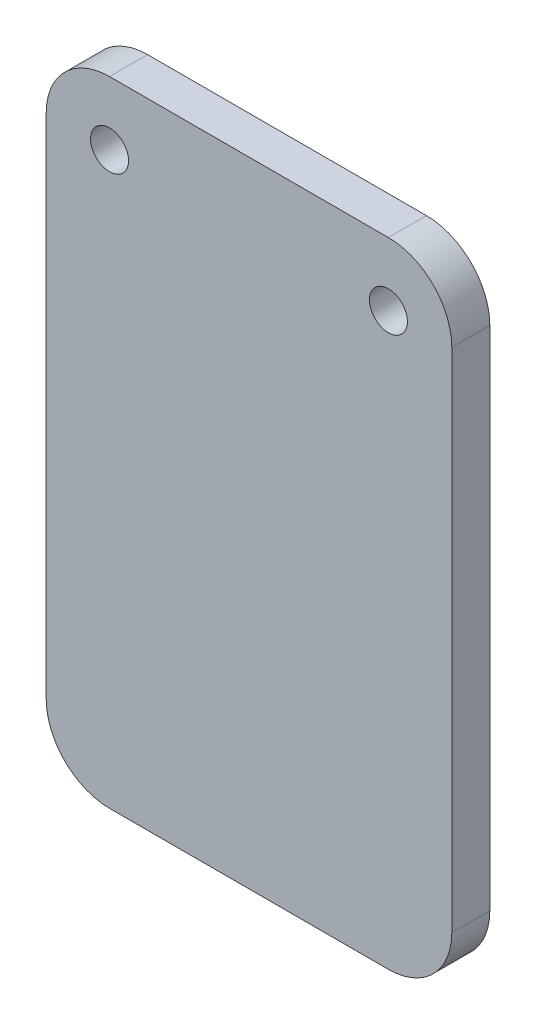
ISO-10303-21;
HEADER;
FILE_DESCRIPTION(('STEP AP214'),'2;1');
FILE_NAME('part.step','',(''),(''),'','','');
FILE_SCHEMA(('AUTOMOTIVE_DESIGN { 1 0 10303 214 1 1 1 1 }'));
ENDSEC;
DATA;
#1=APPLICATION_CONTEXT('core data for automotive mechanical design processes');
#2=APPLICATION_PROTOCOL_DEFINITION('international standard','automotive_design',2000,#1);
#3=PRODUCT_CONTEXT('',#1,'mechanical');
#4=PRODUCT('Part','Part','',(#3));
#5=PRODUCT_RELATED_PRODUCT_CATEGORY('part','',(#4));
#6=PRODUCT_DEFINITION_FORMATION('','',#4);
#7=PRODUCT_DEFINITION_CONTEXT('part definition',#1,'design');
#8=PRODUCT_DEFINITION('design','',#6,#7);
#9=PRODUCT_DEFINITION_SHAPE('','',#8);
#10=(LENGTH_UNIT() NAMED_UNIT(*) SI_UNIT(.MILLI.,.METRE.));
#11=(NAMED_UNIT(*) PLANE_ANGLE_UNIT() SI_UNIT($,.RADIAN.));
#12=(NAMED_UNIT(*) SI_UNIT($,.STERADIAN.) SOLID_ANGLE_UNIT());
#13=UNCERTAINTY_MEASURE_WITH_UNIT(LENGTH_MEASURE(1.E-05),#10,'distance_accuracy_value','');
#14=(GEOMETRIC_REPRESENTATION_CONTEXT(3) GLOBAL_UNCERTAINTY_ASSIGNED_CONTEXT((#13)) GLOBAL_UNIT_ASSIGNED_CONTEXT((#10,
#11,#12)) REPRESENTATION_CONTEXT('',''));
#15=CARTESIAN_POINT('',(0.,0.,0.));
#16=DIRECTION('',(0.,0.,1.));
#17=DIRECTION('',(1.,0.,0.));
#18=AXIS2_PLACEMENT_3D('',#15,#16,#17);
#19=CARTESIAN_POINT('',(27.,45.,3.));
#20=DIRECTION('',(0.,0.,-1.));
#21=DIRECTION('',(-1.,0.,0.));
#22=AXIS2_PLACEMENT_3D('',#19,#20,#21);
#23=PLANE('',#22);
#24=CARTESIAN_POINT('',(27.,45.,3.));
#25=DIRECTION('',(0.,0.,1.));
#26=DIRECTION('',(-1.,0.,0.));
#27=AXIS2_PLACEMENT_3D('',#24,#25,#26);
#28=CIRCLE('',#27,4.99999999999999);
#29=CARTESIAN_POINT('',(32.,45.,3.));
#30=VERTEX_POINT('',#29);
#31=CARTESIAN_POINT('',(27.,50.,3.));
#32=VERTEX_POINT('',#31);
#33=EDGE_CURVE('E145',#30,#32,#28,.T.);
#34=ORIENTED_EDGE('',*,*,#33,.T.);
#35=DIRECTION('',(-1.,0.,0.));
#36=VECTOR('',#35,1.);
#37=CARTESIAN_POINT('',(5.00000000000004,50.,3.));
#38=LINE('',#37,#36);
#39=CARTESIAN_POINT('',(5.00000000000004,50.,3.));
#40=VERTEX_POINT('',#39);
#41=EDGE_CURVE('E93',#32,#40,#38,.T.);
#42=ORIENTED_EDGE('',*,*,#41,.T.);
#43=CARTESIAN_POINT('',(5.,45.,3.));
#44=DIRECTION('',(0.,0.,1.));
#45=DIRECTION('',(-1.,0.,0.));
#46=AXIS2_PLACEMENT_3D('',#43,#44,#45);
#47=CIRCLE('',#46,5.);
#48=CARTESIAN_POINT('',(0.,45.,3.));
#49=VERTEX_POINT('',#48);
#50=EDGE_CURVE('E160',#40,#49,#47,.T.);
#51=ORIENTED_EDGE('',*,*,#50,.T.);
#52=DIRECTION('',(0.,-1.,0.));
#53=VECTOR('',#52,1.);
#54=CARTESIAN_POINT('',(0.,5.00000000000004,3.));
#55=LINE('',#54,#53);
#56=CARTESIAN_POINT('',(0.,5.00000000000004,3.));
#57=VERTEX_POINT('',#56);
#58=EDGE_CURVE('E173',#49,#57,#55,.T.);
#59=ORIENTED_EDGE('',*,*,#58,.T.);
#60=CARTESIAN_POINT('',(5.,5.,3.));
#61=DIRECTION('',(0.,0.,1.));
#62=DIRECTION('',(-1.,0.,0.));
#63=AXIS2_PLACEMENT_3D('',#60,#61,#62);
#64=CIRCLE('',#63,5.);
#65=CARTESIAN_POINT('',(5.00000000000004,0.,3.));
#66=VERTEX_POINT('',#65);
#67=EDGE_CURVE('E112',#57,#66,#64,.T.);
#68=ORIENTED_EDGE('',*,*,#67,.T.);
#69=DIRECTION('',(1.,0.,0.));
#70=VECTOR('',#69,1.);
#71=CARTESIAN_POINT('',(5.00000000000004,0.,3.));
#72=LINE('',#71,#70);
#73=CARTESIAN_POINT('',(27.,0.,3.));
#74=VERTEX_POINT('',#73);
#75=EDGE_CURVE('E106',#66,#74,#72,.T.);
#76=ORIENTED_EDGE('',*,*,#75,.T.);
#77=CARTESIAN_POINT('',(27.,5.,3.));
#78=DIRECTION('',(0.,0.,1.));
#79=DIRECTION('',(1.,0.,0.));
#80=AXIS2_PLACEMENT_3D('',#77,#78,#79);
#81=CIRCLE('',#80,4.99999999999999);
#82=CARTESIAN_POINT('',(32.,5.,3.));
#83=VERTEX_POINT('',#82);
#84=EDGE_CURVE('E110',#74,#83,#81,.T.);
#85=ORIENTED_EDGE('',*,*,#84,.T.);
#86=DIRECTION('',(0.,1.,0.));
#87=VECTOR('',#86,1.);
#88=CARTESIAN_POINT('',(32.,5.,3.));
#89=LINE('',#88,#87);
#90=EDGE_CURVE('E50',#83,#30,#89,.T.);
#91=ORIENTED_EDGE('',*,*,#90,.T.);
#92=EDGE_LOOP('',(#34,#42,#51,#59,#68,#76,#85,#91));
#93=FACE_BOUND('',#92,.T.);
#94=CARTESIAN_POINT('',(5.,45.,3.));
#95=DIRECTION('',(0.,0.,1.));
#96=DIRECTION('',(1.,0.,0.));
#97=AXIS2_PLACEMENT_3D('',#94,#95,#96);
#98=CIRCLE('',#97,1.5);
#99=CARTESIAN_POINT('',(6.5,45.,3.));
#100=VERTEX_POINT('',#99);
#101=EDGE_CURVE('E134',#100,#100,#98,.T.);
#102=ORIENTED_EDGE('',*,*,#101,.F.);
#103=EDGE_LOOP('',(#102));
#104=FACE_BOUND('',#103,.T.);
#105=CARTESIAN_POINT('',(27.,45.,3.));
#106=DIRECTION('',(0.,0.,1.));
#107=DIRECTION('',(-1.,0.,0.));
#108=AXIS2_PLACEMENT_3D('',#105,#106,#107);
#109=CIRCLE('',#108,1.50000000000001);
#110=CARTESIAN_POINT('',(25.5,45.,3.));
#111=VERTEX_POINT('',#110);
#112=EDGE_CURVE('E182',#111,#111,#109,.T.);
#113=ORIENTED_EDGE('',*,*,#112,.F.);
#114=EDGE_LOOP('',(#113));
#115=FACE_BOUND('',#114,.T.);
#116=ADVANCED_FACE('F33',(#93,#104,#115),#23,.F.);
#117=CARTESIAN_POINT('',(27.,45.,0.));
#118=DIRECTION('',(0.,0.,-1.));
#119=DIRECTION('',(-1.,0.,0.));
#120=AXIS2_PLACEMENT_3D('',#117,#118,#119);
#121=PLANE('',#120);
#122=CARTESIAN_POINT('',(5.,45.,0.));
#123=DIRECTION('',(0.,0.,1.));
#124=DIRECTION('',(1.,0.,0.));
#125=AXIS2_PLACEMENT_3D('',#122,#123,#124);
#126=CIRCLE('',#125,1.5);
#127=CARTESIAN_POINT('',(6.5,45.,0.));
#128=VERTEX_POINT('',#127);
#129=EDGE_CURVE('E179',#128,#128,#126,.T.);
#130=ORIENTED_EDGE('',*,*,#129,.T.);
#131=EDGE_LOOP('',(#130));
#132=FACE_BOUND('',#131,.T.);
#133=CARTESIAN_POINT('',(27.,45.,0.));
#134=DIRECTION('',(0.,0.,1.));
#135=DIRECTION('',(-1.,0.,0.));
#136=AXIS2_PLACEMENT_3D('',#133,#134,#135);
#137=CIRCLE('',#136,4.99999999999999);
#138=CARTESIAN_POINT('',(32.,45.,0.));
#139=VERTEX_POINT('',#138);
#140=CARTESIAN_POINT('',(27.,50.,0.));
#141=VERTEX_POINT('',#140);
#142=EDGE_CURVE('E130',#139,#141,#137,.T.);
#143=ORIENTED_EDGE('',*,*,#142,.F.);
#144=DIRECTION('',(0.,1.,0.));
#145=VECTOR('',#144,1.);
#146=CARTESIAN_POINT('',(32.,5.,0.));
#147=LINE('',#146,#145);
#148=CARTESIAN_POINT('',(32.,5.,0.));
#149=VERTEX_POINT('',#148);
#150=EDGE_CURVE('E85',#149,#139,#147,.T.);
#151=ORIENTED_EDGE('',*,*,#150,.F.);
#152=CARTESIAN_POINT('',(27.,5.,0.));
#153=DIRECTION('',(0.,0.,1.));
#154=DIRECTION('',(1.,0.,0.));
#155=AXIS2_PLACEMENT_3D('',#152,#153,#154);
#156=CIRCLE('',#155,4.99999999999999);
#157=CARTESIAN_POINT('',(27.,0.,0.));
#158=VERTEX_POINT('',#157);
#159=EDGE_CURVE('E79',#158,#149,#156,.T.);
#160=ORIENTED_EDGE('',*,*,#159,.F.);
#161=DIRECTION('',(1.,0.,0.));
#162=VECTOR('',#161,1.);
#163=CARTESIAN_POINT('',(5.00000000000004,0.,0.));
#164=LINE('',#163,#162);
#165=CARTESIAN_POINT('',(5.00000000000004,0.,0.));
#166=VERTEX_POINT('',#165);
#167=EDGE_CURVE('E120',#166,#158,#164,.T.);
#168=ORIENTED_EDGE('',*,*,#167,.F.);
#169=CARTESIAN_POINT('',(5.,5.,0.));
#170=DIRECTION('',(0.,0.,1.));
#171=DIRECTION('',(-1.,0.,0.));
#172=AXIS2_PLACEMENT_3D('',#169,#170,#171);
#173=CIRCLE('',#172,5.);
#174=CARTESIAN_POINT('',(0.,5.00000000000004,0.));
#175=VERTEX_POINT('',#174);
#176=EDGE_CURVE('E140',#175,#166,#173,.T.);
#177=ORIENTED_EDGE('',*,*,#176,.F.);
#178=DIRECTION('',(0.,-1.,0.));
#179=VECTOR('',#178,1.);
#180=CARTESIAN_POINT('',(0.,5.00000000000004,0.));
#181=LINE('',#180,#179);
#182=CARTESIAN_POINT('',(0.,45.,0.));
#183=VERTEX_POINT('',#182);
#184=EDGE_CURVE('E138',#183,#175,#181,.T.);
#185=ORIENTED_EDGE('',*,*,#184,.F.);
#186=CARTESIAN_POINT('',(5.,45.,0.));
#187=DIRECTION('',(0.,0.,1.));
#188=DIRECTION('',(-1.,0.,0.));
#189=AXIS2_PLACEMENT_3D('',#186,#187,#188);
#190=CIRCLE('',#189,5.);
#191=CARTESIAN_POINT('',(5.00000000000004,50.,0.));
#192=VERTEX_POINT('',#191);
#193=EDGE_CURVE('E136',#192,#183,#190,.T.);
#194=ORIENTED_EDGE('',*,*,#193,.F.);
#195=DIRECTION('',(-1.,0.,0.));
#196=VECTOR('',#195,1.);
#197=CARTESIAN_POINT('',(5.00000000000004,50.,0.));
#198=LINE('',#197,#196);
#199=EDGE_CURVE('E133',#141,#192,#198,.T.);
#200=ORIENTED_EDGE('',*,*,#199,.F.);
#201=EDGE_LOOP('',(#143,#151,#160,#168,#177,#185,#194,#200));
#202=FACE_BOUND('',#201,.T.);
#203=CARTESIAN_POINT('',(27.,45.,0.));
#204=DIRECTION('',(0.,0.,1.));
#205=DIRECTION('',(-1.,0.,0.));
#206=AXIS2_PLACEMENT_3D('',#203,#204,#205);
#207=CIRCLE('',#206,1.50000000000001);
#208=CARTESIAN_POINT('',(25.5,45.,0.));
#209=VERTEX_POINT('',#208);
#210=EDGE_CURVE('E185',#209,#209,#207,.T.);
#211=ORIENTED_EDGE('',*,*,#210,.T.);
#212=EDGE_LOOP('',(#211));
#213=FACE_BOUND('',#212,.T.);
#214=ADVANCED_FACE('F164',(#132,#202,#213),#121,.T.);
#215=CARTESIAN_POINT('',(27.,45.,3.));
#216=DIRECTION('',(0.,0.,-1.));
#217=DIRECTION('',(-1.,0.,0.));
#218=AXIS2_PLACEMENT_3D('',#215,#216,#217);
#219=CYLINDRICAL_SURFACE('',#218,4.99999999999999);
#220=ORIENTED_EDGE('',*,*,#142,.T.);
#221=DIRECTION('',(0.,0.,-1.));
#222=VECTOR('',#221,1.);
#223=CARTESIAN_POINT('',(27.,50.,3.));
#224=LINE('',#223,#222);
#225=EDGE_CURVE('E11',#32,#141,#224,.T.);
#226=ORIENTED_EDGE('',*,*,#225,.F.);
#227=ORIENTED_EDGE('',*,*,#33,.F.);
#228=DIRECTION('',(0.,0.,-1.));
#229=VECTOR('',#228,1.);
#230=CARTESIAN_POINT('',(32.,45.,3.));
#231=LINE('',#230,#229);
#232=EDGE_CURVE('E126',#30,#139,#231,.T.);
#233=ORIENTED_EDGE('',*,*,#232,.T.);
#234=EDGE_LOOP('',(#220,#226,#227,#233));
#235=FACE_BOUND('',#234,.T.);
#236=ADVANCED_FACE('F35',(#235),#219,.T.);
#237=CARTESIAN_POINT('',(5.00000000000004,50.,3.));
#238=DIRECTION('',(0.,-1.,0.));
#239=DIRECTION('',(0.,0.,-1.));
#240=AXIS2_PLACEMENT_3D('',#237,#238,#239);
#241=PLANE('',#240);
#242=ORIENTED_EDGE('',*,*,#199,.T.);
#243=DIRECTION('',(0.,0.,-1.));
#244=VECTOR('',#243,1.);
#245=CARTESIAN_POINT('',(5.00000000000004,50.,3.));
#246=LINE('',#245,#244);
#247=EDGE_CURVE('E42',#40,#192,#246,.T.);
#248=ORIENTED_EDGE('',*,*,#247,.F.);
#249=ORIENTED_EDGE('',*,*,#41,.F.);
#250=ORIENTED_EDGE('',*,*,#225,.T.);
#251=EDGE_LOOP('',(#242,#248,#249,#250));
#252=FACE_BOUND('',#251,.T.);
#253=ADVANCED_FACE('F217',(#252),#241,.F.);
#254=CARTESIAN_POINT('',(5.,45.,3.));
#255=DIRECTION('',(0.,0.,-1.));
#256=DIRECTION('',(-1.,0.,0.));
#257=AXIS2_PLACEMENT_3D('',#254,#255,#256);
#258=CYLINDRICAL_SURFACE('',#257,5.);
#259=ORIENTED_EDGE('',*,*,#193,.T.);
#260=DIRECTION('',(0.,0.,-1.));
#261=VECTOR('',#260,1.);
#262=CARTESIAN_POINT('',(0.,45.,3.));
#263=LINE('',#262,#261);
#264=EDGE_CURVE('E152',#49,#183,#263,.T.);
#265=ORIENTED_EDGE('',*,*,#264,.F.);
#266=ORIENTED_EDGE('',*,*,#50,.F.);
#267=ORIENTED_EDGE('',*,*,#247,.T.);
#268=EDGE_LOOP('',(#259,#265,#266,#267));
#269=FACE_BOUND('',#268,.T.);
#270=ADVANCED_FACE('F158',(#269),#258,.T.);
#271=CARTESIAN_POINT('',(0.,5.00000000000004,3.));
#272=DIRECTION('',(1.,0.,0.));
#273=DIRECTION('',(0.,0.,-1.));
#274=AXIS2_PLACEMENT_3D('',#271,#272,#273);
#275=PLANE('',#274);
#276=ORIENTED_EDGE('',*,*,#184,.T.);
#277=DIRECTION('',(0.,0.,-1.));
#278=VECTOR('',#277,1.);
#279=CARTESIAN_POINT('',(0.,5.00000000000004,3.));
#280=LINE('',#279,#278);
#281=EDGE_CURVE('E149',#57,#175,#280,.T.);
#282=ORIENTED_EDGE('',*,*,#281,.F.);
#283=ORIENTED_EDGE('',*,*,#58,.F.);
#284=ORIENTED_EDGE('',*,*,#264,.T.);
#285=EDGE_LOOP('',(#276,#282,#283,#284));
#286=FACE_BOUND('',#285,.T.);
#287=ADVANCED_FACE('F169',(#286),#275,.F.);
#288=CARTESIAN_POINT('',(5.,5.,3.));
#289=DIRECTION('',(0.,0.,-1.));
#290=DIRECTION('',(-1.,0.,0.));
#291=AXIS2_PLACEMENT_3D('',#288,#289,#290);
#292=CYLINDRICAL_SURFACE('',#291,5.);
#293=ORIENTED_EDGE('',*,*,#176,.T.);
#294=DIRECTION('',(0.,0.,-1.));
#295=VECTOR('',#294,1.);
#296=CARTESIAN_POINT('',(5.00000000000004,0.,3.));
#297=LINE('',#296,#295);
#298=EDGE_CURVE('E121',#66,#166,#297,.T.);
#299=ORIENTED_EDGE('',*,*,#298,.F.);
#300=ORIENTED_EDGE('',*,*,#67,.F.);
#301=ORIENTED_EDGE('',*,*,#281,.T.);
#302=EDGE_LOOP('',(#293,#299,#300,#301));
#303=FACE_BOUND('',#302,.T.);
#304=ADVANCED_FACE('F172',(#303),#292,.T.);
#305=CARTESIAN_POINT('',(5.00000000000004,0.,3.));
#306=DIRECTION('',(0.,1.,0.));
#307=DIRECTION('',(-1.,0.,0.));
#308=AXIS2_PLACEMENT_3D('',#305,#306,#307);
#309=PLANE('',#308);
#310=ORIENTED_EDGE('',*,*,#167,.T.);
#311=DIRECTION('',(0.,0.,-1.));
#312=VECTOR('',#311,1.);
#313=CARTESIAN_POINT('',(27.,0.,3.));
#314=LINE('',#313,#312);
#315=EDGE_CURVE('E117',#74,#158,#314,.T.);
#316=ORIENTED_EDGE('',*,*,#315,.F.);
#317=ORIENTED_EDGE('',*,*,#75,.F.);
#318=ORIENTED_EDGE('',*,*,#298,.T.);
#319=EDGE_LOOP('',(#310,#316,#317,#318));
#320=FACE_BOUND('',#319,.T.);
#321=ADVANCED_FACE('F118',(#320),#309,.F.);
#322=CARTESIAN_POINT('',(27.,5.,3.));
#323=DIRECTION('',(0.,0.,-1.));
#324=DIRECTION('',(-1.,0.,0.));
#325=AXIS2_PLACEMENT_3D('',#322,#323,#324);
#326=CYLINDRICAL_SURFACE('',#325,4.99999999999999);
#327=ORIENTED_EDGE('',*,*,#159,.T.);
#328=DIRECTION('',(0.,0.,-1.));
#329=VECTOR('',#328,1.);
#330=CARTESIAN_POINT('',(32.,5.,3.));
#331=LINE('',#330,#329);
#332=EDGE_CURVE('E122',#83,#149,#331,.T.);
#333=ORIENTED_EDGE('',*,*,#332,.F.);
#334=ORIENTED_EDGE('',*,*,#84,.F.);
#335=ORIENTED_EDGE('',*,*,#315,.T.);
#336=EDGE_LOOP('',(#327,#333,#334,#335));
#337=FACE_BOUND('',#336,.T.);
#338=ADVANCED_FACE('F124',(#337),#326,.T.);
#339=CARTESIAN_POINT('',(32.,5.,3.));
#340=DIRECTION('',(-1.,0.,0.));
#341=DIRECTION('',(0.,-1.,0.));
#342=AXIS2_PLACEMENT_3D('',#339,#340,#341);
#343=PLANE('',#342);
#344=ORIENTED_EDGE('',*,*,#150,.T.);
#345=ORIENTED_EDGE('',*,*,#232,.F.);
#346=ORIENTED_EDGE('',*,*,#90,.F.);
#347=ORIENTED_EDGE('',*,*,#332,.T.);
#348=EDGE_LOOP('',(#344,#345,#346,#347));
#349=FACE_BOUND('',#348,.T.);
#350=ADVANCED_FACE('F205',(#349),#343,.F.);
#351=CARTESIAN_POINT('',(5.,45.,3.));
#352=DIRECTION('',(0.,0.,-1.));
#353=DIRECTION('',(-1.,0.,0.));
#354=AXIS2_PLACEMENT_3D('',#351,#352,#353);
#355=CYLINDRICAL_SURFACE('',#354,1.5);
#356=ORIENTED_EDGE('',*,*,#101,.T.);
#357=EDGE_LOOP('',(#356));
#358=FACE_BOUND('',#357,.T.);
#359=ORIENTED_EDGE('',*,*,#129,.F.);
#360=EDGE_LOOP('',(#359));
#361=FACE_BOUND('',#360,.T.);
#362=ADVANCED_FACE('F202',(#358,#361),#355,.F.);
#363=CARTESIAN_POINT('',(27.,45.,3.));
#364=DIRECTION('',(0.,0.,-1.));
#365=DIRECTION('',(-1.,0.,0.));
#366=AXIS2_PLACEMENT_3D('',#363,#364,#365);
#367=CYLINDRICAL_SURFACE('',#366,1.50000000000001);
#368=ORIENTED_EDGE('',*,*,#112,.T.);
#369=EDGE_LOOP('',(#368));
#370=FACE_BOUND('',#369,.T.);
#371=ORIENTED_EDGE('',*,*,#210,.F.);
#372=EDGE_LOOP('',(#371));
#373=FACE_BOUND('',#372,.T.);
#374=ADVANCED_FACE('F191',(#370,#373),#367,.F.);
#375=CLOSED_SHELL('',(#116,#214,#236,#253,#270,#287,#304,#321,#338,#350,#362,#374));
#376=MANIFOLD_SOLID_BREP('B2',#375);
#377=ADVANCED_BREP_SHAPE_REPRESENTATION('',(#18,#376),#14);
#378=SHAPE_DEFINITION_REPRESENTATION(#9,#377);
ENDSEC;
END-ISO-10303-21;
